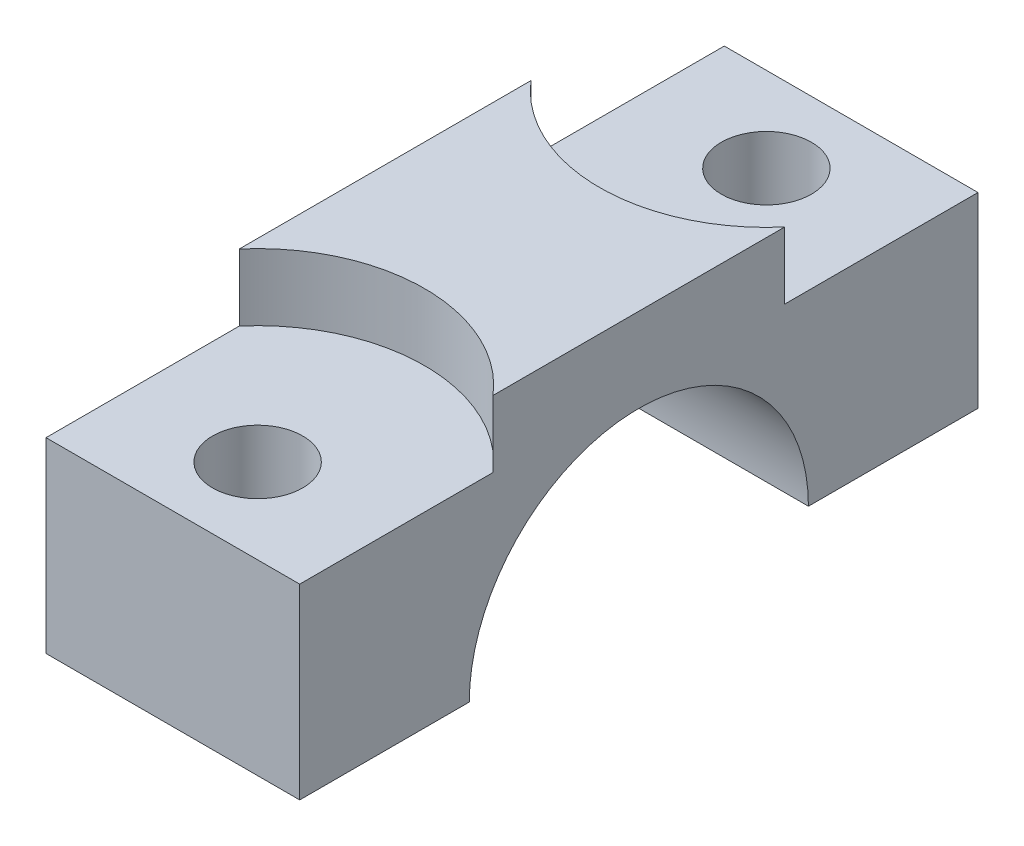
ISO-10303-21;
HEADER;
FILE_DESCRIPTION(('STEP AP214'),'2;1');
FILE_NAME('part.step','',(''),(''),'','','');
FILE_SCHEMA(('AUTOMOTIVE_DESIGN { 1 0 10303 214 1 1 1 1 }'));
ENDSEC;
DATA;
#1=APPLICATION_CONTEXT('core data for automotive mechanical design processes');
#2=APPLICATION_PROTOCOL_DEFINITION('international standard','automotive_design',2000,#1);
#3=PRODUCT_CONTEXT('',#1,'mechanical');
#4=PRODUCT('Part','Part','',(#3));
#5=PRODUCT_RELATED_PRODUCT_CATEGORY('part','',(#4));
#6=PRODUCT_DEFINITION_FORMATION('','',#4);
#7=PRODUCT_DEFINITION_CONTEXT('part definition',#1,'design');
#8=PRODUCT_DEFINITION('design','',#6,#7);
#9=PRODUCT_DEFINITION_SHAPE('','',#8);
#10=(LENGTH_UNIT() NAMED_UNIT(*) SI_UNIT(.MILLI.,.METRE.));
#11=(NAMED_UNIT(*) PLANE_ANGLE_UNIT() SI_UNIT($,.RADIAN.));
#12=(NAMED_UNIT(*) SI_UNIT($,.STERADIAN.) SOLID_ANGLE_UNIT());
#13=UNCERTAINTY_MEASURE_WITH_UNIT(LENGTH_MEASURE(1.E-05),#10,'distance_accuracy_value','');
#14=(GEOMETRIC_REPRESENTATION_CONTEXT(3) GLOBAL_UNCERTAINTY_ASSIGNED_CONTEXT((#13)) GLOBAL_UNIT_ASSIGNED_CONTEXT((#10,
#11,#12)) REPRESENTATION_CONTEXT('',''));
#15=CARTESIAN_POINT('',(0.,0.,0.));
#16=DIRECTION('',(0.,0.,1.));
#17=DIRECTION('',(1.,0.,0.));
#18=AXIS2_PLACEMENT_3D('',#15,#16,#17);
#19=CARTESIAN_POINT('',(9.5,19.,25.4));
#20=DIRECTION('',(0.,-1.,0.));
#21=DIRECTION('',(0.,0.,-1.));
#22=AXIS2_PLACEMENT_3D('',#19,#20,#21);
#23=PLANE('',#22);
#24=DIRECTION('',(0.,0.,1.));
#25=VECTOR('',#24,1.);
#26=CARTESIAN_POINT('',(9.5,19.,25.4));
#27=LINE('',#26,#25);
#28=CARTESIAN_POINT('',(9.5,19.,-10.9259615953641));
#29=VERTEX_POINT('',#28);
#30=CARTESIAN_POINT('',(9.5,19.,10.925961595364));
#31=VERTEX_POINT('',#30);
#32=EDGE_CURVE('E137',#29,#31,#27,.T.);
#33=ORIENTED_EDGE('',*,*,#32,.F.);
#34=CARTESIAN_POINT('',(0.,19.,-19.05));
#35=DIRECTION('',(0.,1.,0.));
#36=DIRECTION('',(0.,0.,1.));
#37=AXIS2_PLACEMENT_3D('',#34,#35,#36);
#38=CIRCLE('',#37,12.5);
#39=CARTESIAN_POINT('',(-9.5,19.,-10.9259615953641));
#40=VERTEX_POINT('',#39);
#41=EDGE_CURVE('E115',#40,#29,#38,.T.);
#42=ORIENTED_EDGE('',*,*,#41,.F.);
#43=DIRECTION('',(0.,0.,1.));
#44=VECTOR('',#43,1.);
#45=CARTESIAN_POINT('',(-9.5,19.,25.4));
#46=LINE('',#45,#44);
#47=CARTESIAN_POINT('',(-9.5,19.,10.925961595364));
#48=VERTEX_POINT('',#47);
#49=EDGE_CURVE('E157',#40,#48,#46,.T.);
#50=ORIENTED_EDGE('',*,*,#49,.T.);
#51=CARTESIAN_POINT('',(0.,19.,19.05));
#52=DIRECTION('',(0.,1.,0.));
#53=DIRECTION('',(0.,0.,1.));
#54=AXIS2_PLACEMENT_3D('',#51,#52,#53);
#55=CIRCLE('',#54,12.5);
#56=EDGE_CURVE('E191',#31,#48,#55,.T.);
#57=ORIENTED_EDGE('',*,*,#56,.F.);
#58=EDGE_LOOP('',(#33,#42,#50,#57));
#59=FACE_BOUND('',#58,.T.);
#60=ADVANCED_FACE('F37',(#59),#23,.F.);
#61=CARTESIAN_POINT('',(9.5,19.,25.4));
#62=DIRECTION('',(0.,0.,-1.));
#63=DIRECTION('',(0.,1.,0.));
#64=AXIS2_PLACEMENT_3D('',#61,#62,#63);
#65=PLANE('',#64);
#66=DIRECTION('',(0.,-1.,0.));
#67=VECTOR('',#66,1.);
#68=CARTESIAN_POINT('',(9.5,19.,25.4));
#69=LINE('',#68,#67);
#70=CARTESIAN_POINT('',(9.5,14.,25.4));
#71=VERTEX_POINT('',#70);
#72=CARTESIAN_POINT('',(9.5,0.,25.4));
#73=VERTEX_POINT('',#72);
#74=EDGE_CURVE('E159',#71,#73,#69,.T.);
#75=ORIENTED_EDGE('',*,*,#74,.F.);
#76=DIRECTION('',(-1.,0.,0.));
#77=VECTOR('',#76,1.);
#78=CARTESIAN_POINT('',(9.5,14.,25.4));
#79=LINE('',#78,#77);
#80=CARTESIAN_POINT('',(-9.5,14.,25.4));
#81=VERTEX_POINT('',#80);
#82=EDGE_CURVE('E202',#71,#81,#79,.T.);
#83=ORIENTED_EDGE('',*,*,#82,.T.);
#84=DIRECTION('',(0.,-1.,0.));
#85=VECTOR('',#84,1.);
#86=CARTESIAN_POINT('',(-9.5,19.,25.4));
#87=LINE('',#86,#85);
#88=CARTESIAN_POINT('',(-9.5,0.,25.4));
#89=VERTEX_POINT('',#88);
#90=EDGE_CURVE('E145',#81,#89,#87,.T.);
#91=ORIENTED_EDGE('',*,*,#90,.T.);
#92=DIRECTION('',(-1.,0.,0.));
#93=VECTOR('',#92,1.);
#94=CARTESIAN_POINT('',(9.5,0.,25.4));
#95=LINE('',#94,#93);
#96=EDGE_CURVE('E167',#73,#89,#95,.T.);
#97=ORIENTED_EDGE('',*,*,#96,.F.);
#98=EDGE_LOOP('',(#75,#83,#91,#97));
#99=FACE_BOUND('',#98,.T.);
#100=ADVANCED_FACE('F39',(#99),#65,.F.);
#101=CARTESIAN_POINT('',(9.5,0.,25.4));
#102=DIRECTION('',(0.,1.,0.));
#103=DIRECTION('',(0.,0.,1.));
#104=AXIS2_PLACEMENT_3D('',#101,#102,#103);
#105=PLANE('',#104);
#106=CARTESIAN_POINT('',(0.,0.,19.05));
#107=DIRECTION('',(0.,1.,0.));
#108=DIRECTION('',(0.,0.,1.));
#109=AXIS2_PLACEMENT_3D('',#106,#107,#108);
#110=CIRCLE('',#109,3.375);
#111=CARTESIAN_POINT('',(0.,0.,22.425));
#112=VERTEX_POINT('',#111);
#113=EDGE_CURVE('E199',#112,#112,#110,.T.);
#114=ORIENTED_EDGE('',*,*,#113,.T.);
#115=EDGE_LOOP('',(#114));
#116=FACE_BOUND('',#115,.T.);
#117=DIRECTION('',(0.,0.,-1.));
#118=VECTOR('',#117,1.);
#119=CARTESIAN_POINT('',(-9.5,0.,25.4));
#120=LINE('',#119,#118);
#121=CARTESIAN_POINT('',(-9.5,0.,12.7));
#122=VERTEX_POINT('',#121);
#123=EDGE_CURVE('E147',#89,#122,#120,.T.);
#124=ORIENTED_EDGE('',*,*,#123,.T.);
#125=DIRECTION('',(-1.,0.,0.));
#126=VECTOR('',#125,1.);
#127=CARTESIAN_POINT('',(9.5,0.,12.7));
#128=LINE('',#127,#126);
#129=CARTESIAN_POINT('',(9.5,0.,12.7));
#130=VERTEX_POINT('',#129);
#131=EDGE_CURVE('E164',#130,#122,#128,.T.);
#132=ORIENTED_EDGE('',*,*,#131,.F.);
#133=DIRECTION('',(0.,0.,-1.));
#134=VECTOR('',#133,1.);
#135=CARTESIAN_POINT('',(9.5,0.,25.4));
#136=LINE('',#135,#134);
#137=EDGE_CURVE('E208',#73,#130,#136,.T.);
#138=ORIENTED_EDGE('',*,*,#137,.F.);
#139=ORIENTED_EDGE('',*,*,#96,.T.);
#140=EDGE_LOOP('',(#124,#132,#138,#139));
#141=FACE_BOUND('',#140,.T.);
#142=ADVANCED_FACE('F224',(#116,#141),#105,.F.);
#143=CARTESIAN_POINT('',(9.5,0.,0.));
#144=DIRECTION('',(-1.,0.,0.));
#145=DIRECTION('',(0.,0.,1.));
#146=AXIS2_PLACEMENT_3D('',#143,#144,#145);
#147=CYLINDRICAL_SURFACE('',#146,12.7);
#148=CARTESIAN_POINT('',(-9.5,0.,0.));
#149=DIRECTION('',(-1.,0.,0.));
#150=DIRECTION('',(0.,0.,1.));
#151=AXIS2_PLACEMENT_3D('',#148,#149,#150);
#152=CIRCLE('',#151,12.7);
#153=CARTESIAN_POINT('',(-9.5,0.,-12.7));
#154=VERTEX_POINT('',#153);
#155=EDGE_CURVE('E150',#122,#154,#152,.T.);
#156=ORIENTED_EDGE('',*,*,#155,.T.);
#157=DIRECTION('',(-1.,0.,0.));
#158=VECTOR('',#157,1.);
#159=CARTESIAN_POINT('',(9.5,0.,-12.7));
#160=LINE('',#159,#158);
#161=CARTESIAN_POINT('',(9.5,0.,-12.7));
#162=VERTEX_POINT('',#161);
#163=EDGE_CURVE('E161',#162,#154,#160,.T.);
#164=ORIENTED_EDGE('',*,*,#163,.F.);
#165=CARTESIAN_POINT('',(9.5,0.,0.));
#166=DIRECTION('',(-1.,0.,0.));
#167=DIRECTION('',(0.,0.,1.));
#168=AXIS2_PLACEMENT_3D('',#165,#166,#167);
#169=CIRCLE('',#168,12.7);
#170=EDGE_CURVE('E141',#130,#162,#169,.T.);
#171=ORIENTED_EDGE('',*,*,#170,.F.);
#172=ORIENTED_EDGE('',*,*,#131,.T.);
#173=EDGE_LOOP('',(#156,#164,#171,#172));
#174=FACE_BOUND('',#173,.T.);
#175=ADVANCED_FACE('F214',(#174),#147,.F.);
#176=CARTESIAN_POINT('',(9.5,0.,-12.7));
#177=DIRECTION('',(0.,1.,0.));
#178=DIRECTION('',(0.,0.,1.));
#179=AXIS2_PLACEMENT_3D('',#176,#177,#178);
#180=PLANE('',#179);
#181=CARTESIAN_POINT('',(0.,0.,-19.05));
#182=DIRECTION('',(0.,1.,0.));
#183=DIRECTION('',(0.,0.,1.));
#184=AXIS2_PLACEMENT_3D('',#181,#182,#183);
#185=CIRCLE('',#184,3.375);
#186=CARTESIAN_POINT('',(0.,0.,-15.675));
#187=VERTEX_POINT('',#186);
#188=EDGE_CURVE('E119',#187,#187,#185,.T.);
#189=ORIENTED_EDGE('',*,*,#188,.T.);
#190=EDGE_LOOP('',(#189));
#191=FACE_BOUND('',#190,.T.);
#192=DIRECTION('',(0.,0.,-1.));
#193=VECTOR('',#192,1.);
#194=CARTESIAN_POINT('',(-9.5,0.,-12.7));
#195=LINE('',#194,#193);
#196=CARTESIAN_POINT('',(-9.5,0.,-25.4));
#197=VERTEX_POINT('',#196);
#198=EDGE_CURVE('E152',#154,#197,#195,.T.);
#199=ORIENTED_EDGE('',*,*,#198,.T.);
#200=DIRECTION('',(-1.,0.,0.));
#201=VECTOR('',#200,1.);
#202=CARTESIAN_POINT('',(9.5,0.,-25.4));
#203=LINE('',#202,#201);
#204=CARTESIAN_POINT('',(9.5,0.,-25.4));
#205=VERTEX_POINT('',#204);
#206=EDGE_CURVE('E139',#205,#197,#203,.T.);
#207=ORIENTED_EDGE('',*,*,#206,.F.);
#208=DIRECTION('',(0.,0.,-1.));
#209=VECTOR('',#208,1.);
#210=CARTESIAN_POINT('',(9.5,0.,-12.7));
#211=LINE('',#210,#209);
#212=EDGE_CURVE('E133',#162,#205,#211,.T.);
#213=ORIENTED_EDGE('',*,*,#212,.F.);
#214=ORIENTED_EDGE('',*,*,#163,.T.);
#215=EDGE_LOOP('',(#199,#207,#213,#214));
#216=FACE_BOUND('',#215,.T.);
#217=ADVANCED_FACE('F218',(#191,#216),#180,.F.);
#218=CARTESIAN_POINT('',(9.5,19.,-25.4));
#219=DIRECTION('',(0.,0.,1.));
#220=DIRECTION('',(0.,-1.,0.));
#221=AXIS2_PLACEMENT_3D('',#218,#219,#220);
#222=PLANE('',#221);
#223=DIRECTION('',(0.,1.,0.));
#224=VECTOR('',#223,1.);
#225=CARTESIAN_POINT('',(-9.5,19.,-25.4));
#226=LINE('',#225,#224);
#227=CARTESIAN_POINT('',(-9.5,14.,-25.4));
#228=VERTEX_POINT('',#227);
#229=EDGE_CURVE('E154',#197,#228,#226,.T.);
#230=ORIENTED_EDGE('',*,*,#229,.T.);
#231=DIRECTION('',(1.,0.,0.));
#232=VECTOR('',#231,1.);
#233=CARTESIAN_POINT('',(9.5,14.,-25.4));
#234=LINE('',#233,#232);
#235=CARTESIAN_POINT('',(9.5,14.,-25.4));
#236=VERTEX_POINT('',#235);
#237=EDGE_CURVE('E118',#228,#236,#234,.T.);
#238=ORIENTED_EDGE('',*,*,#237,.T.);
#239=DIRECTION('',(0.,1.,0.));
#240=VECTOR('',#239,1.);
#241=CARTESIAN_POINT('',(9.5,19.,-25.4));
#242=LINE('',#241,#240);
#243=EDGE_CURVE('E131',#205,#236,#242,.T.);
#244=ORIENTED_EDGE('',*,*,#243,.F.);
#245=ORIENTED_EDGE('',*,*,#206,.T.);
#246=EDGE_LOOP('',(#230,#238,#244,#245));
#247=FACE_BOUND('',#246,.T.);
#248=ADVANCED_FACE('F220',(#247),#222,.F.);
#249=CARTESIAN_POINT('',(9.5,0.,0.));
#250=DIRECTION('',(-1.,0.,0.));
#251=DIRECTION('',(0.,0.,1.));
#252=AXIS2_PLACEMENT_3D('',#249,#250,#251);
#253=PLANE('',#252);
#254=ORIENTED_EDGE('',*,*,#243,.T.);
#255=DIRECTION('',(0.,0.,1.));
#256=VECTOR('',#255,1.);
#257=CARTESIAN_POINT('',(9.5,14.,0.));
#258=LINE('',#257,#256);
#259=CARTESIAN_POINT('',(9.5,14.,-10.9259615953641));
#260=VERTEX_POINT('',#259);
#261=EDGE_CURVE('E11',#236,#260,#258,.T.);
#262=ORIENTED_EDGE('',*,*,#261,.T.);
#263=DIRECTION('',(0.,1.,0.));
#264=VECTOR('',#263,1.);
#265=CARTESIAN_POINT('',(9.5,19.,-10.9259615953641));
#266=LINE('',#265,#264);
#267=EDGE_CURVE('E112',#260,#29,#266,.T.);
#268=ORIENTED_EDGE('',*,*,#267,.T.);
#269=ORIENTED_EDGE('',*,*,#32,.T.);
#270=DIRECTION('',(0.,1.,0.));
#271=VECTOR('',#270,1.);
#272=CARTESIAN_POINT('',(9.5,19.,10.925961595364));
#273=LINE('',#272,#271);
#274=CARTESIAN_POINT('',(9.5,14.,10.925961595364));
#275=VERTEX_POINT('',#274);
#276=EDGE_CURVE('E174',#31,#275,#273,.F.);
#277=ORIENTED_EDGE('',*,*,#276,.T.);
#278=DIRECTION('',(0.,0.,1.));
#279=VECTOR('',#278,1.);
#280=CARTESIAN_POINT('',(9.5,14.,0.));
#281=LINE('',#280,#279);
#282=EDGE_CURVE('E148',#275,#71,#281,.T.);
#283=ORIENTED_EDGE('',*,*,#282,.T.);
#284=ORIENTED_EDGE('',*,*,#74,.T.);
#285=ORIENTED_EDGE('',*,*,#137,.T.);
#286=ORIENTED_EDGE('',*,*,#170,.T.);
#287=ORIENTED_EDGE('',*,*,#212,.T.);
#288=EDGE_LOOP('',(#254,#262,#268,#269,#277,#283,#284,#285,#286,#287));
#289=FACE_BOUND('',#288,.T.);
#290=ADVANCED_FACE('F129',(#289),#253,.F.);
#291=CARTESIAN_POINT('',(-9.5,0.,0.));
#292=DIRECTION('',(-1.,0.,0.));
#293=DIRECTION('',(0.,0.,1.));
#294=AXIS2_PLACEMENT_3D('',#291,#292,#293);
#295=PLANE('',#294);
#296=DIRECTION('',(0.,0.,1.));
#297=VECTOR('',#296,1.);
#298=CARTESIAN_POINT('',(-9.5,14.,0.));
#299=LINE('',#298,#297);
#300=CARTESIAN_POINT('',(-9.5,14.,-10.9259615953641));
#301=VERTEX_POINT('',#300);
#302=EDGE_CURVE('E45',#228,#301,#299,.T.);
#303=ORIENTED_EDGE('',*,*,#302,.F.);
#304=ORIENTED_EDGE('',*,*,#229,.F.);
#305=ORIENTED_EDGE('',*,*,#198,.F.);
#306=ORIENTED_EDGE('',*,*,#155,.F.);
#307=ORIENTED_EDGE('',*,*,#123,.F.);
#308=ORIENTED_EDGE('',*,*,#90,.F.);
#309=DIRECTION('',(0.,0.,1.));
#310=VECTOR('',#309,1.);
#311=CARTESIAN_POINT('',(-9.5,14.,0.));
#312=LINE('',#311,#310);
#313=CARTESIAN_POINT('',(-9.5,14.,10.925961595364));
#314=VERTEX_POINT('',#313);
#315=EDGE_CURVE('E170',#314,#81,#312,.T.);
#316=ORIENTED_EDGE('',*,*,#315,.F.);
#317=DIRECTION('',(0.,1.,0.));
#318=VECTOR('',#317,1.);
#319=CARTESIAN_POINT('',(-9.5,19.,10.925961595364));
#320=LINE('',#319,#318);
#321=EDGE_CURVE('E172',#48,#314,#320,.F.);
#322=ORIENTED_EDGE('',*,*,#321,.F.);
#323=ORIENTED_EDGE('',*,*,#49,.F.);
#324=DIRECTION('',(0.,1.,0.));
#325=VECTOR('',#324,1.);
#326=CARTESIAN_POINT('',(-9.5,19.,-10.9259615953641));
#327=LINE('',#326,#325);
#328=EDGE_CURVE('E177',#301,#40,#327,.T.);
#329=ORIENTED_EDGE('',*,*,#328,.F.);
#330=EDGE_LOOP('',(#303,#304,#305,#306,#307,#308,#316,#322,#323,#329));
#331=FACE_BOUND('',#330,.T.);
#332=ADVANCED_FACE('F185',(#331),#295,.T.);
#333=CARTESIAN_POINT('',(0.,19.,19.05));
#334=DIRECTION('',(0.,1.,0.));
#335=DIRECTION('',(0.,0.,1.));
#336=AXIS2_PLACEMENT_3D('',#333,#334,#335);
#337=CYLINDRICAL_SURFACE('',#336,12.5);
#338=ORIENTED_EDGE('',*,*,#56,.T.);
#339=ORIENTED_EDGE('',*,*,#321,.T.);
#340=CARTESIAN_POINT('',(0.,14.,19.05));
#341=DIRECTION('',(0.,1.,0.));
#342=DIRECTION('',(0.,0.,1.));
#343=AXIS2_PLACEMENT_3D('',#340,#341,#342);
#344=CIRCLE('',#343,12.5);
#345=EDGE_CURVE('E60',#275,#314,#344,.T.);
#346=ORIENTED_EDGE('',*,*,#345,.F.);
#347=ORIENTED_EDGE('',*,*,#276,.F.);
#348=EDGE_LOOP('',(#338,#339,#346,#347));
#349=FACE_BOUND('',#348,.T.);
#350=ADVANCED_FACE('F189',(#349),#337,.F.);
#351=CARTESIAN_POINT('',(3.37500000000001,14.,19.05));
#352=DIRECTION('',(0.,-1.,0.));
#353=DIRECTION('',(0.,0.,-1.));
#354=AXIS2_PLACEMENT_3D('',#351,#352,#353);
#355=PLANE('',#354);
#356=CARTESIAN_POINT('',(0.,14.,19.05));
#357=DIRECTION('',(0.,1.,0.));
#358=DIRECTION('',(0.,0.,1.));
#359=AXIS2_PLACEMENT_3D('',#356,#357,#358);
#360=CIRCLE('',#359,3.37500000000001);
#361=CARTESIAN_POINT('',(0.,14.,22.425));
#362=VERTEX_POINT('',#361);
#363=EDGE_CURVE('E193',#362,#362,#360,.T.);
#364=ORIENTED_EDGE('',*,*,#363,.F.);
#365=EDGE_LOOP('',(#364));
#366=FACE_BOUND('',#365,.T.);
#367=ORIENTED_EDGE('',*,*,#345,.T.);
#368=ORIENTED_EDGE('',*,*,#315,.T.);
#369=ORIENTED_EDGE('',*,*,#82,.F.);
#370=ORIENTED_EDGE('',*,*,#282,.F.);
#371=EDGE_LOOP('',(#367,#368,#369,#370));
#372=FACE_BOUND('',#371,.T.);
#373=ADVANCED_FACE('F227',(#366,#372),#355,.F.);
#374=CARTESIAN_POINT('',(0.,19.,19.05));
#375=DIRECTION('',(0.,1.,0.));
#376=DIRECTION('',(0.,0.,1.));
#377=AXIS2_PLACEMENT_3D('',#374,#375,#376);
#378=CYLINDRICAL_SURFACE('',#377,3.375);
#379=ORIENTED_EDGE('',*,*,#113,.F.);
#380=EDGE_LOOP('',(#379));
#381=FACE_BOUND('',#380,.T.);
#382=ORIENTED_EDGE('',*,*,#363,.T.);
#383=EDGE_LOOP('',(#382));
#384=FACE_BOUND('',#383,.T.);
#385=ADVANCED_FACE('F229',(#381,#384),#378,.F.);
#386=CARTESIAN_POINT('',(3.37500000000001,14.,-19.05));
#387=DIRECTION('',(0.,-1.,0.));
#388=DIRECTION('',(0.,0.,-1.));
#389=AXIS2_PLACEMENT_3D('',#386,#387,#388);
#390=PLANE('',#389);
#391=CARTESIAN_POINT('',(0.,14.,-19.05));
#392=DIRECTION('',(0.,1.,0.));
#393=DIRECTION('',(0.,0.,1.));
#394=AXIS2_PLACEMENT_3D('',#391,#392,#393);
#395=CIRCLE('',#394,3.37500000000001);
#396=CARTESIAN_POINT('',(0.,14.,-15.675));
#397=VERTEX_POINT('',#396);
#398=EDGE_CURVE('E126',#397,#397,#395,.T.);
#399=ORIENTED_EDGE('',*,*,#398,.F.);
#400=EDGE_LOOP('',(#399));
#401=FACE_BOUND('',#400,.T.);
#402=ORIENTED_EDGE('',*,*,#237,.F.);
#403=ORIENTED_EDGE('',*,*,#302,.T.);
#404=CARTESIAN_POINT('',(0.,14.,-19.05));
#405=DIRECTION('',(0.,1.,0.));
#406=DIRECTION('',(0.,0.,1.));
#407=AXIS2_PLACEMENT_3D('',#404,#405,#406);
#408=CIRCLE('',#407,12.5);
#409=EDGE_CURVE('E52',#301,#260,#408,.T.);
#410=ORIENTED_EDGE('',*,*,#409,.T.);
#411=ORIENTED_EDGE('',*,*,#261,.F.);
#412=EDGE_LOOP('',(#402,#403,#410,#411));
#413=FACE_BOUND('',#412,.T.);
#414=ADVANCED_FACE('F122',(#401,#413),#390,.F.);
#415=CARTESIAN_POINT('',(0.,19.,-19.05));
#416=DIRECTION('',(0.,1.,0.));
#417=DIRECTION('',(0.,0.,1.));
#418=AXIS2_PLACEMENT_3D('',#415,#416,#417);
#419=CYLINDRICAL_SURFACE('',#418,12.5);
#420=ORIENTED_EDGE('',*,*,#409,.F.);
#421=ORIENTED_EDGE('',*,*,#328,.T.);
#422=ORIENTED_EDGE('',*,*,#41,.T.);
#423=ORIENTED_EDGE('',*,*,#267,.F.);
#424=EDGE_LOOP('',(#420,#421,#422,#423));
#425=FACE_BOUND('',#424,.T.);
#426=ADVANCED_FACE('F113',(#425),#419,.F.);
#427=CARTESIAN_POINT('',(0.,19.,-19.05));
#428=DIRECTION('',(0.,1.,0.));
#429=DIRECTION('',(0.,0.,1.));
#430=AXIS2_PLACEMENT_3D('',#427,#428,#429);
#431=CYLINDRICAL_SURFACE('',#430,3.375);
#432=ORIENTED_EDGE('',*,*,#188,.F.);
#433=EDGE_LOOP('',(#432));
#434=FACE_BOUND('',#433,.T.);
#435=ORIENTED_EDGE('',*,*,#398,.T.);
#436=EDGE_LOOP('',(#435));
#437=FACE_BOUND('',#436,.T.);
#438=ADVANCED_FACE('F307',(#434,#437),#431,.F.);
#439=CLOSED_SHELL('',(#60,#100,#142,#175,#217,#248,#290,#332,#350,#373,#385,#414,#426,#438));
#440=MANIFOLD_SOLID_BREP('B2',#439);
#441=ADVANCED_BREP_SHAPE_REPRESENTATION('',(#18,#440),#14);
#442=SHAPE_DEFINITION_REPRESENTATION(#9,#441);
ENDSEC;
END-ISO-10303-21;
